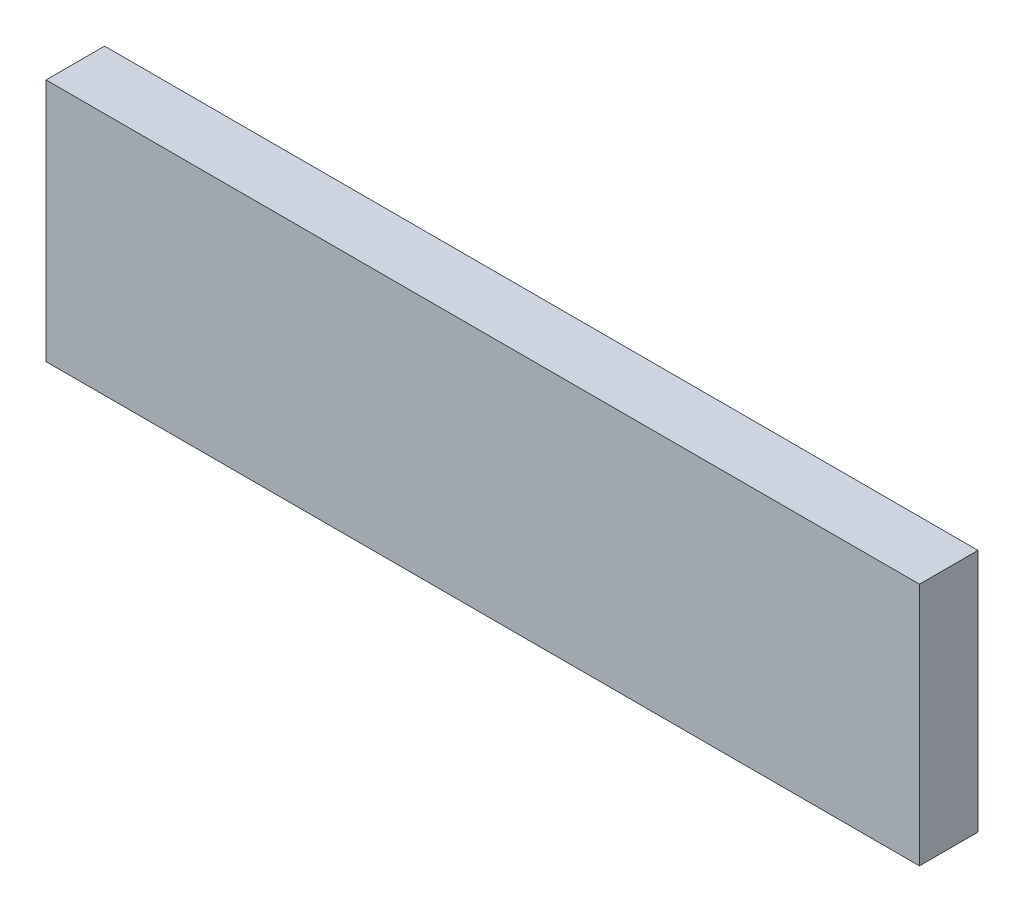
ISO-10303-21;
HEADER;
FILE_DESCRIPTION(('STEP AP214'),'2;1');
FILE_NAME('part.step','',(''),(''),'','','');
FILE_SCHEMA(('AUTOMOTIVE_DESIGN { 1 0 10303 214 1 1 1 1 }'));
ENDSEC;
DATA;
#1=APPLICATION_CONTEXT('core data for automotive mechanical design processes');
#2=APPLICATION_PROTOCOL_DEFINITION('international standard','automotive_design',2000,#1);
#3=PRODUCT_CONTEXT('',#1,'mechanical');
#4=PRODUCT('Part','Part','',(#3));
#5=PRODUCT_RELATED_PRODUCT_CATEGORY('part','',(#4));
#6=PRODUCT_DEFINITION_FORMATION('','',#4);
#7=PRODUCT_DEFINITION_CONTEXT('part definition',#1,'design');
#8=PRODUCT_DEFINITION('design','',#6,#7);
#9=PRODUCT_DEFINITION_SHAPE('','',#8);
#10=(LENGTH_UNIT() NAMED_UNIT(*) SI_UNIT(.MILLI.,.METRE.));
#11=(NAMED_UNIT(*) PLANE_ANGLE_UNIT() SI_UNIT($,.RADIAN.));
#12=(NAMED_UNIT(*) SI_UNIT($,.STERADIAN.) SOLID_ANGLE_UNIT());
#13=UNCERTAINTY_MEASURE_WITH_UNIT(LENGTH_MEASURE(1.E-05),#10,'distance_accuracy_value','');
#14=(GEOMETRIC_REPRESENTATION_CONTEXT(3) GLOBAL_UNCERTAINTY_ASSIGNED_CONTEXT((#13)) GLOBAL_UNIT_ASSIGNED_CONTEXT((#10,
#11,#12)) REPRESENTATION_CONTEXT('',''));
#15=CARTESIAN_POINT('',(0.,0.,0.));
#16=DIRECTION('',(0.,0.,1.));
#17=DIRECTION('',(1.,0.,0.));
#18=AXIS2_PLACEMENT_3D('',#15,#16,#17);
#19=CARTESIAN_POINT('',(89.5,25.,6.));
#20=DIRECTION('',(-1.,0.,0.));
#21=DIRECTION('',(0.,-1.,0.));
#22=AXIS2_PLACEMENT_3D('',#19,#20,#21);
#23=PLANE('',#22);
#24=DIRECTION('',(0.,1.,0.));
#25=VECTOR('',#24,1.);
#26=CARTESIAN_POINT('',(89.5,25.,-6.));
#27=LINE('',#26,#25);
#28=CARTESIAN_POINT('',(89.5,-25.,-6.));
#29=VERTEX_POINT('',#28);
#30=CARTESIAN_POINT('',(89.5,25.,-6.));
#31=VERTEX_POINT('',#30);
#32=EDGE_CURVE('E98',#29,#31,#27,.T.);
#33=ORIENTED_EDGE('',*,*,#32,.T.);
#34=DIRECTION('',(0.,0.,-1.));
#35=VECTOR('',#34,1.);
#36=CARTESIAN_POINT('',(89.5,25.,6.));
#37=LINE('',#36,#35);
#38=CARTESIAN_POINT('',(89.5,25.,6.));
#39=VERTEX_POINT('',#38);
#40=EDGE_CURVE('E11',#39,#31,#37,.T.);
#41=ORIENTED_EDGE('',*,*,#40,.F.);
#42=DIRECTION('',(0.,1.,0.));
#43=VECTOR('',#42,1.);
#44=CARTESIAN_POINT('',(89.5,25.,6.));
#45=LINE('',#44,#43);
#46=CARTESIAN_POINT('',(89.5,-25.,6.));
#47=VERTEX_POINT('',#46);
#48=EDGE_CURVE('E86',#47,#39,#45,.T.);
#49=ORIENTED_EDGE('',*,*,#48,.F.);
#50=DIRECTION('',(0.,0.,-1.));
#51=VECTOR('',#50,1.);
#52=CARTESIAN_POINT('',(89.5,-25.,6.));
#53=LINE('',#52,#51);
#54=EDGE_CURVE('E94',#47,#29,#53,.T.);
#55=ORIENTED_EDGE('',*,*,#54,.T.);
#56=EDGE_LOOP('',(#33,#41,#49,#55));
#57=FACE_BOUND('',#56,.T.);
#58=ADVANCED_FACE('F35',(#57),#23,.F.);
#59=CARTESIAN_POINT('',(-89.5,25.,6.));
#60=DIRECTION('',(0.,-1.,0.));
#61=DIRECTION('',(0.,0.,-1.));
#62=AXIS2_PLACEMENT_3D('',#59,#60,#61);
#63=PLANE('',#62);
#64=DIRECTION('',(-1.,0.,0.));
#65=VECTOR('',#64,1.);
#66=CARTESIAN_POINT('',(-89.5,25.,-6.));
#67=LINE('',#66,#65);
#68=CARTESIAN_POINT('',(-89.5,25.,-6.));
#69=VERTEX_POINT('',#68);
#70=EDGE_CURVE('E90',#31,#69,#67,.T.);
#71=ORIENTED_EDGE('',*,*,#70,.T.);
#72=DIRECTION('',(0.,0.,-1.));
#73=VECTOR('',#72,1.);
#74=CARTESIAN_POINT('',(-89.5,25.,6.));
#75=LINE('',#74,#73);
#76=CARTESIAN_POINT('',(-89.5,25.,6.));
#77=VERTEX_POINT('',#76);
#78=EDGE_CURVE('E43',#77,#69,#75,.T.);
#79=ORIENTED_EDGE('',*,*,#78,.F.);
#80=DIRECTION('',(-1.,0.,0.));
#81=VECTOR('',#80,1.);
#82=CARTESIAN_POINT('',(-89.5,25.,6.));
#83=LINE('',#82,#81);
#84=EDGE_CURVE('E81',#39,#77,#83,.T.);
#85=ORIENTED_EDGE('',*,*,#84,.F.);
#86=ORIENTED_EDGE('',*,*,#40,.T.);
#87=EDGE_LOOP('',(#71,#79,#85,#86));
#88=FACE_BOUND('',#87,.T.);
#89=ADVANCED_FACE('F89',(#88),#63,.F.);
#90=CARTESIAN_POINT('',(-89.5,25.,6.));
#91=DIRECTION('',(1.,0.,0.));
#92=DIRECTION('',(0.,1.,0.));
#93=AXIS2_PLACEMENT_3D('',#90,#91,#92);
#94=PLANE('',#93);
#95=DIRECTION('',(0.,-1.,0.));
#96=VECTOR('',#95,1.);
#97=CARTESIAN_POINT('',(-89.5,25.,-6.));
#98=LINE('',#97,#96);
#99=CARTESIAN_POINT('',(-89.5,-25.,-6.));
#100=VERTEX_POINT('',#99);
#101=EDGE_CURVE('E68',#69,#100,#98,.T.);
#102=ORIENTED_EDGE('',*,*,#101,.T.);
#103=DIRECTION('',(0.,0.,-1.));
#104=VECTOR('',#103,1.);
#105=CARTESIAN_POINT('',(-89.5,-25.,6.));
#106=LINE('',#105,#104);
#107=CARTESIAN_POINT('',(-89.5,-25.,6.));
#108=VERTEX_POINT('',#107);
#109=EDGE_CURVE('E91',#108,#100,#106,.T.);
#110=ORIENTED_EDGE('',*,*,#109,.F.);
#111=DIRECTION('',(0.,-1.,0.));
#112=VECTOR('',#111,1.);
#113=CARTESIAN_POINT('',(-89.5,25.,6.));
#114=LINE('',#113,#112);
#115=EDGE_CURVE('E84',#77,#108,#114,.T.);
#116=ORIENTED_EDGE('',*,*,#115,.F.);
#117=ORIENTED_EDGE('',*,*,#78,.T.);
#118=EDGE_LOOP('',(#102,#110,#116,#117));
#119=FACE_BOUND('',#118,.T.);
#120=ADVANCED_FACE('F92',(#119),#94,.F.);
#121=CARTESIAN_POINT('',(-89.5,-25.,6.));
#122=DIRECTION('',(0.,1.,0.));
#123=DIRECTION('',(0.,0.,1.));
#124=AXIS2_PLACEMENT_3D('',#121,#122,#123);
#125=PLANE('',#124);
#126=CARTESIAN_POINT('',(69.,-25.,0.));
#127=DIRECTION('',(0.,-1.,0.));
#128=DIRECTION('',(0.,0.,-1.));
#129=AXIS2_PLACEMENT_3D('',#126,#127,#128);
#130=CIRCLE('',#129,2.99999999999999);
#131=CARTESIAN_POINT('',(69.,-25.,-2.99999999999999));
#132=VERTEX_POINT('',#131);
#133=EDGE_CURVE('E118',#132,#132,#130,.T.);
#134=ORIENTED_EDGE('',*,*,#133,.F.);
#135=EDGE_LOOP('',(#134));
#136=FACE_BOUND('',#135,.T.);
#137=CARTESIAN_POINT('',(-81.,-25.,0.));
#138=DIRECTION('',(0.,-1.,0.));
#139=DIRECTION('',(0.,0.,-1.));
#140=AXIS2_PLACEMENT_3D('',#137,#138,#139);
#141=CIRCLE('',#140,2.99999999999999);
#142=CARTESIAN_POINT('',(-81.,-25.,-2.99999999999999));
#143=VERTEX_POINT('',#142);
#144=EDGE_CURVE('E112',#143,#143,#141,.T.);
#145=ORIENTED_EDGE('',*,*,#144,.F.);
#146=EDGE_LOOP('',(#145));
#147=FACE_BOUND('',#146,.T.);
#148=DIRECTION('',(1.,0.,0.));
#149=VECTOR('',#148,1.);
#150=CARTESIAN_POINT('',(-89.5,-25.,-6.));
#151=LINE('',#150,#149);
#152=EDGE_CURVE('E74',#100,#29,#151,.T.);
#153=ORIENTED_EDGE('',*,*,#152,.T.);
#154=ORIENTED_EDGE('',*,*,#54,.F.);
#155=DIRECTION('',(1.,0.,0.));
#156=VECTOR('',#155,1.);
#157=CARTESIAN_POINT('',(-89.5,-25.,6.));
#158=LINE('',#157,#156);
#159=EDGE_CURVE('E51',#108,#47,#158,.T.);
#160=ORIENTED_EDGE('',*,*,#159,.F.);
#161=ORIENTED_EDGE('',*,*,#109,.T.);
#162=EDGE_LOOP('',(#153,#154,#160,#161));
#163=FACE_BOUND('',#162,.T.);
#164=ADVANCED_FACE('F106',(#136,#147,#163),#125,.F.);
#165=CARTESIAN_POINT('',(0.,0.,6.));
#166=DIRECTION('',(0.,0.,1.));
#167=DIRECTION('',(1.,0.,0.));
#168=AXIS2_PLACEMENT_3D('',#165,#166,#167);
#169=PLANE('',#168);
#170=ORIENTED_EDGE('',*,*,#48,.T.);
#171=ORIENTED_EDGE('',*,*,#84,.T.);
#172=ORIENTED_EDGE('',*,*,#115,.T.);
#173=ORIENTED_EDGE('',*,*,#159,.T.);
#174=EDGE_LOOP('',(#170,#171,#172,#173));
#175=FACE_BOUND('',#174,.T.);
#176=ADVANCED_FACE('F82',(#175),#169,.T.);
#177=CARTESIAN_POINT('',(0.,0.,-6.));
#178=DIRECTION('',(0.,0.,1.));
#179=DIRECTION('',(1.,0.,0.));
#180=AXIS2_PLACEMENT_3D('',#177,#178,#179);
#181=PLANE('',#180);
#182=ORIENTED_EDGE('',*,*,#32,.F.);
#183=ORIENTED_EDGE('',*,*,#152,.F.);
#184=ORIENTED_EDGE('',*,*,#101,.F.);
#185=ORIENTED_EDGE('',*,*,#70,.F.);
#186=EDGE_LOOP('',(#182,#183,#184,#185));
#187=FACE_BOUND('',#186,.T.);
#188=ADVANCED_FACE('F109',(#187),#181,.F.);
#189=CARTESIAN_POINT('',(-81.,-5.,0.));
#190=DIRECTION('',(0.,-1.,0.));
#191=DIRECTION('',(0.,0.,-1.));
#192=AXIS2_PLACEMENT_3D('',#189,#190,#191);
#193=CYLINDRICAL_SURFACE('',#192,2.99999999999999);
#194=CARTESIAN_POINT('',(-81.,-5.,0.));
#195=DIRECTION('',(0.,-1.,0.));
#196=DIRECTION('',(0.,0.,-1.));
#197=AXIS2_PLACEMENT_3D('',#194,#195,#196);
#198=CIRCLE('',#197,2.99999999999999);
#199=CARTESIAN_POINT('',(-81.,-5.,-2.99999999999999));
#200=VERTEX_POINT('',#199);
#201=EDGE_CURVE('E101',#200,#200,#198,.T.);
#202=ORIENTED_EDGE('',*,*,#201,.F.);
#203=EDGE_LOOP('',(#202));
#204=FACE_BOUND('',#203,.T.);
#205=ORIENTED_EDGE('',*,*,#144,.T.);
#206=EDGE_LOOP('',(#205));
#207=FACE_BOUND('',#206,.T.);
#208=ADVANCED_FACE('F138',(#204,#207),#193,.F.);
#209=CARTESIAN_POINT('',(-81.,-5.,0.));
#210=DIRECTION('',(0.,-1.,0.));
#211=DIRECTION('',(0.,0.,-1.));
#212=AXIS2_PLACEMENT_3D('',#209,#210,#211);
#213=PLANE('',#212);
#214=ORIENTED_EDGE('',*,*,#201,.T.);
#215=EDGE_LOOP('',(#214));
#216=FACE_BOUND('',#215,.T.);
#217=ADVANCED_FACE('F129',(#216),#213,.T.);
#218=CARTESIAN_POINT('',(69.,-5.,0.));
#219=DIRECTION('',(0.,-1.,0.));
#220=DIRECTION('',(0.,0.,-1.));
#221=AXIS2_PLACEMENT_3D('',#218,#219,#220);
#222=CYLINDRICAL_SURFACE('',#221,2.99999999999999);
#223=CARTESIAN_POINT('',(69.,-5.,0.));
#224=DIRECTION('',(0.,-1.,0.));
#225=DIRECTION('',(0.,0.,-1.));
#226=AXIS2_PLACEMENT_3D('',#223,#224,#225);
#227=CIRCLE('',#226,2.99999999999999);
#228=CARTESIAN_POINT('',(69.,-5.,-2.99999999999999));
#229=VERTEX_POINT('',#228);
#230=EDGE_CURVE('E115',#229,#229,#227,.T.);
#231=ORIENTED_EDGE('',*,*,#230,.F.);
#232=EDGE_LOOP('',(#231));
#233=FACE_BOUND('',#232,.T.);
#234=ORIENTED_EDGE('',*,*,#133,.T.);
#235=EDGE_LOOP('',(#234));
#236=FACE_BOUND('',#235,.T.);
#237=ADVANCED_FACE('F126',(#233,#236),#222,.F.);
#238=CARTESIAN_POINT('',(69.,-5.,0.));
#239=DIRECTION('',(0.,-1.,0.));
#240=DIRECTION('',(0.,0.,-1.));
#241=AXIS2_PLACEMENT_3D('',#238,#239,#240);
#242=PLANE('',#241);
#243=ORIENTED_EDGE('',*,*,#230,.T.);
#244=EDGE_LOOP('',(#243));
#245=FACE_BOUND('',#244,.T.);
#246=ADVANCED_FACE('F124',(#245),#242,.T.);
#247=CLOSED_SHELL('',(#58,#89,#120,#164,#176,#188,#208,#217,#237,#246));
#248=MANIFOLD_SOLID_BREP('B2',#247);
#249=ADVANCED_BREP_SHAPE_REPRESENTATION('',(#18,#248),#14);
#250=SHAPE_DEFINITION_REPRESENTATION(#9,#249);
ENDSEC;
END-ISO-10303-21;
